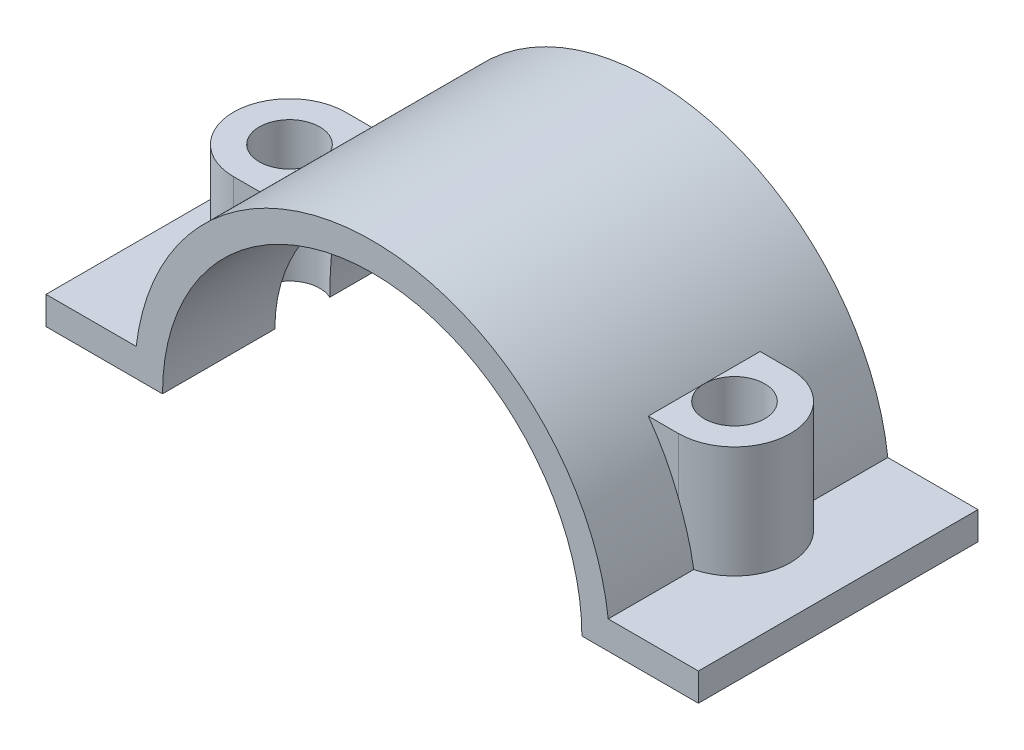
ISO-10303-21;
HEADER;
FILE_DESCRIPTION(('STEP AP214'),'2;1');
FILE_NAME('part.step','',(''),(''),'','','');
FILE_SCHEMA(('AUTOMOTIVE_DESIGN { 1 0 10303 214 1 1 1 1 }'));
ENDSEC;
DATA;
#1=APPLICATION_CONTEXT('core data for automotive mechanical design processes');
#2=APPLICATION_PROTOCOL_DEFINITION('international standard','automotive_design',2000,#1);
#3=PRODUCT_CONTEXT('',#1,'mechanical');
#4=PRODUCT('Part','Part','',(#3));
#5=PRODUCT_RELATED_PRODUCT_CATEGORY('part','',(#4));
#6=PRODUCT_DEFINITION_FORMATION('','',#4);
#7=PRODUCT_DEFINITION_CONTEXT('part definition',#1,'design');
#8=PRODUCT_DEFINITION('design','',#6,#7);
#9=PRODUCT_DEFINITION_SHAPE('','',#8);
#10=(LENGTH_UNIT() NAMED_UNIT(*) SI_UNIT(.MILLI.,.METRE.));
#11=(NAMED_UNIT(*) PLANE_ANGLE_UNIT() SI_UNIT($,.RADIAN.));
#12=(NAMED_UNIT(*) SI_UNIT($,.STERADIAN.) SOLID_ANGLE_UNIT());
#13=UNCERTAINTY_MEASURE_WITH_UNIT(LENGTH_MEASURE(1.E-05),#10,'distance_accuracy_value','');
#14=(GEOMETRIC_REPRESENTATION_CONTEXT(3) GLOBAL_UNCERTAINTY_ASSIGNED_CONTEXT((#13)) GLOBAL_UNIT_ASSIGNED_CONTEXT((#10,
#11,#12)) REPRESENTATION_CONTEXT('',''));
#15=CARTESIAN_POINT('',(0.,0.,0.));
#16=DIRECTION('',(0.,0.,1.));
#17=DIRECTION('',(1.,0.,0.));
#18=AXIS2_PLACEMENT_3D('',#15,#16,#17);
#19=CARTESIAN_POINT('',(0.,0.,15.));
#20=DIRECTION('',(0.,0.,-1.));
#21=DIRECTION('',(-1.,0.,0.));
#22=AXIS2_PLACEMENT_3D('',#19,#20,#21);
#23=CYLINDRICAL_SURFACE('',#22,22.5);
#24=CARTESIAN_POINT('',(22.5,0.,2.94585244223194));
#25=CARTESIAN_POINT('',(22.5000019786438,0.22004829541047,2.94582502954506));
#26=CARTESIAN_POINT('',(22.496771976051,0.440098921720214,2.94434706345401));
#27=CARTESIAN_POINT('',(22.4838614086812,0.879984524522893,2.93829426645985));
#28=CARTESIAN_POINT('',(22.4741803541386,1.09981948337314,2.93371920042374));
#29=CARTESIAN_POINT('',(22.4483384018866,1.53974661329548,2.9212558035351));
#30=CARTESIAN_POINT('',(22.4321561682467,1.75983722837948,2.91335655911638));
#31=CARTESIAN_POINT('',(22.3933430806954,2.19928099204081,2.89384152261642));
#32=CARTESIAN_POINT('',(22.3707123665342,2.41863415649579,2.88222581107707));
#33=CARTESIAN_POINT('',(22.3177048362647,2.86771611810231,2.85399237610849));
#34=CARTESIAN_POINT('',(22.2869860658927,3.09739050786812,2.83714571038818));
#35=CARTESIAN_POINT('',(22.2185524494044,3.55520608774392,2.79779869713993));
#36=CARTESIAN_POINT('',(22.1808378924326,3.7833473408167,2.77529858326245));
#37=CARTESIAN_POINT('',(22.0986125509884,4.23726788281951,2.72346907843097));
#38=CARTESIAN_POINT('',(22.0541122674826,4.46305025497699,2.69415020336566));
#39=CARTESIAN_POINT('',(21.9584991151918,4.91191850706664,2.62707932526148));
#40=CARTESIAN_POINT('',(21.9073877568558,5.13500499024424,2.58932924709352));
#41=CARTESIAN_POINT('',(21.7998289729832,5.57383345127611,2.5040199291954));
#42=CARTESIAN_POINT('',(21.7434877454334,5.78963578722072,2.45663947366215));
#43=CARTESIAN_POINT('',(21.6252370772924,6.21676696922478,2.34895831258528));
#44=CARTESIAN_POINT('',(21.5633227921508,6.42809172200731,2.28864630171863));
#45=CARTESIAN_POINT('',(21.4674570711155,6.73868537467435,2.18613284156853));
#46=CARTESIAN_POINT('',(21.4352043380002,6.84056064775407,2.15020407303379));
#47=CARTESIAN_POINT('',(21.3697921265074,7.04224446072956,2.07369778279248));
#48=CARTESIAN_POINT('',(21.3366328390056,7.14205342802811,2.03312123402708));
#49=CARTESIAN_POINT('',(21.269709677642,7.33895404304251,1.94670028355243));
#50=CARTESIAN_POINT('',(21.235946896523,7.4360499189808,1.9008647213245));
#51=CARTESIAN_POINT('',(21.1681263285494,7.62697016127641,1.80306235107284));
#52=CARTESIAN_POINT('',(21.1340686944474,7.72079610826381,1.75109856012069));
#53=CARTESIAN_POINT('',(21.0757392979934,7.87833413650594,1.6557134191039));
#54=CARTESIAN_POINT('',(21.0514180944343,7.94307261635632,1.6140193807915));
#55=CARTESIAN_POINT('',(21.0031314212219,8.06988666780331,1.52652083152144));
#56=CARTESIAN_POINT('',(20.9791660130466,8.13196178261844,1.4807156196074));
#57=CARTESIAN_POINT('',(20.9319743804309,8.25267464722253,1.38462135264109));
#58=CARTESIAN_POINT('',(20.9087469501857,8.31131815169628,1.33434018283709));
#59=CARTESIAN_POINT('',(20.8634535146701,8.42437031116534,1.22878261003766));
#60=CARTESIAN_POINT('',(20.8413868488207,8.47878138342286,1.17350909788105));
#61=CARTESIAN_POINT('',(20.7942977518278,8.59370862505898,1.04465413885524));
#62=CARTESIAN_POINT('',(20.7696995262872,8.65291739636186,0.969725956397005));
#63=CARTESIAN_POINT('',(20.724562124205,8.76047544105549,0.811262691529925));
#64=CARTESIAN_POINT('',(20.7040185858127,8.80883639177732,0.727737006787183));
#65=CARTESIAN_POINT('',(20.6720940224812,8.88346046495895,0.568827848417073));
#66=CARTESIAN_POINT('',(20.659720642496,8.91215758983417,0.49480248089083));
#67=CARTESIAN_POINT('',(20.6399523791574,8.9578454412186,0.342582102008905));
#68=CARTESIAN_POINT('',(20.6325522185234,8.97484857713334,0.264391605862199));
#69=CARTESIAN_POINT('',(20.6234858809565,8.9956639490221,0.105448870119819));
#70=CARTESIAN_POINT('',(20.6218523630032,8.99940105441533,0.0246846452861547));
#71=CARTESIAN_POINT('',(20.6246121853143,8.99307410226032,-0.136200070882619));
#72=CARTESIAN_POINT('',(20.6290065656823,8.98300766293402,-0.216320448723444));
#73=CARTESIAN_POINT('',(20.6427016005542,8.95148731521266,-0.366738071456857));
#74=CARTESIAN_POINT('',(20.6515620232383,8.93105425902292,-0.437296979580218));
#75=CARTESIAN_POINT('',(20.6731590254648,8.88094816200981,-0.574383004774032));
#76=CARTESIAN_POINT('',(20.685897128057,8.85127149043293,-0.640908525302781));
#77=CARTESIAN_POINT('',(20.7223901646504,8.76559916892526,-0.805115794685439));
#78=CARTESIAN_POINT('',(20.748325820282,8.70415880459091,-0.899462553885803));
#79=CARTESIAN_POINT('',(20.8048456642171,8.56818729043554,-1.07663718150113));
#80=CARTESIAN_POINT('',(20.8354425025953,8.49362042800028,-1.15943249180065));
#81=CARTESIAN_POINT('',(20.8944862378732,8.34719909046049,-1.30287736736085));
#82=CARTESIAN_POINT('',(20.9225719469765,8.27660222314841,-1.36498768691245));
#83=CARTESIAN_POINT('',(20.9798265469158,8.13037801292532,-1.48248007189674));
#84=CARTESIAN_POINT('',(21.0089962352372,8.05474693262348,-1.53785705032177));
#85=CARTESIAN_POINT('',(21.0678384332305,7.89956233855251,-1.64273156681119));
#86=CARTESIAN_POINT('',(21.0975116081605,7.82000331843033,-1.692220499397));
#87=CARTESIAN_POINT('',(21.1569040649136,7.65786333469737,-1.78598396631352));
#88=CARTESIAN_POINT('',(21.186623360279,7.57528119504474,-1.83025644248918));
#89=CARTESIAN_POINT('',(21.2468907937366,7.40460156350316,-1.91577162963314));
#90=CARTESIAN_POINT('',(21.2774284476149,7.31641326889604,-1.95683949793599));
#91=CARTESIAN_POINT('',(21.3379600725344,7.13795151419706,-2.03463582902053));
#92=CARTESIAN_POINT('',(21.3679539215587,7.04767759622676,-2.07136332788278));
#93=CARTESIAN_POINT('',(21.4568691289714,6.77417725311325,-2.17587087204433));
#94=CARTESIAN_POINT('',(21.5146824087259,6.58838996043499,-2.23791899170511));
#95=CARTESIAN_POINT('',(21.6266438306371,6.21106207191854,-2.35027359719613));
#96=CARTESIAN_POINT('',(21.6807689320824,6.0194944915116,-2.40051035978475));
#97=CARTESIAN_POINT('',(21.784399082268,5.63293742157482,-2.4911857249269));
#98=CARTESIAN_POINT('',(21.8339059629967,5.4379493257008,-2.53162822298754));
#99=CARTESIAN_POINT('',(21.9323942002945,5.02681697113072,-2.60801546735056));
#100=CARTESIAN_POINT('',(21.9808856952234,4.81041171934231,-2.64317636090871));
#101=CARTESIAN_POINT('',(22.0716403467898,4.37517205768449,-2.70583150031386));
#102=CARTESIAN_POINT('',(22.1139022221525,4.15633715802279,-2.73332417003607));
#103=CARTESIAN_POINT('',(22.1920515702151,3.71655675986395,-2.78206046126463));
#104=CARTESIAN_POINT('',(22.2279307387261,3.49560890026338,-2.80329596514111));
#105=CARTESIAN_POINT('',(22.2931292927456,3.0523078428312,-2.84054457406559));
#106=CARTESIAN_POINT('',(22.3224484256862,2.82995459122938,-2.85655747804917));
#107=CARTESIAN_POINT('',(22.3736815914145,2.39077381449471,-2.88376441510917));
#108=CARTESIAN_POINT('',(22.3957883855284,2.17397655059012,-2.89508655076947));
#109=CARTESIAN_POINT('',(22.4337037517035,1.73967068926701,-2.91411753874415));
#110=CARTESIAN_POINT('',(22.4495121737262,1.52216207502729,-2.9218263049824));
#111=CARTESIAN_POINT('',(22.474764515414,1.08731380698403,-2.933995966094));
#112=CARTESIAN_POINT('',(22.4842265756365,0.869975460660682,-2.93846612123538));
#113=CARTESIAN_POINT('',(22.4968450260418,0.435090653214143,-2.94438115300763));
#114=CARTESIAN_POINT('',(22.5000018913383,0.217544209007704,-2.94582625758473));
#115=CARTESIAN_POINT('',(22.5,0.,-2.94585244223194));
#116=B_SPLINE_CURVE_WITH_KNOTS('',3,(#24,#25,#26,#27,#28,#29,#30,#31,#32,#33,#34,#35,#36,#37,
#38,#39,#40,#41,#42,#43,#44,#45,#46,#47,#48,#49,#50,#51,#52,#53,#54,#55,#56,#57,#58,#59,#60,#61,
#62,#63,#64,#65,#66,#67,#68,#69,#70,#71,#72,#73,#74,#75,#76,#77,#78,#79,#80,#81,#82,#83,#84,#85,
#86,#87,#88,#89,#90,#91,#92,#93,#94,#95,#96,#97,#98,#99,#100,#101,#102,#103,#104,#105,#106,#107,
#108,#109,#110,#111,#112,#113,#114,#115),.UNSPECIFIED.,.F.,.F.,(4,2,2,2,2,2,2,2,2,2,2,2,2,2,2,2,
2,2,2,2,2,2,2,2,2,2,2,2,2,2,2,2,2,2,2,2,2,2,2,2,2,2,2,2,2,4),(0.,0.660119952515278,
1.32029002720668,1.9826446182481,2.64498485596214,3.34180983768661,4.03860602517878,
4.7343346574878,5.42990461477266,6.11357975970354,6.79785505788478,7.1359734889572,
7.47402126905596,7.81150895153736,8.14883116909893,8.39096500916579,8.63314021183896,
8.87489691522273,9.11651451494224,9.41151793348284,9.70620224982488,9.94629561421661,
10.1861338020197,10.4273281367469,10.6685640943817,10.8896603050445,11.1108434687297,
11.4554802638301,11.8010696098652,12.0950547732489,12.3892606789163,12.6838914226939,
12.978638026629,13.2843896871879,13.5902091226957,14.2022584248279,14.817834743687,
15.4331658236359,16.1065266965556,16.7800258700792,17.4543949878935,18.1287900651223,
18.7833111789586,19.4378478837221,20.0905055832023,20.7431141012859),.UNSPECIFIED.);
#117=CARTESIAN_POINT('',(22.5,0.,2.94585244223194));
#118=VERTEX_POINT('',#117);
#119=CARTESIAN_POINT('',(22.5,0.,-2.94585244223194));
#120=VERTEX_POINT('',#119);
#121=EDGE_CURVE('E53',#118,#120,#116,.T.);
#122=ORIENTED_EDGE('',*,*,#121,.F.);
#123=DIRECTION('',(0.,0.,-1.));
#124=VECTOR('',#123,1.);
#125=CARTESIAN_POINT('',(22.5,0.,15.));
#126=LINE('',#125,#124);
#127=CARTESIAN_POINT('',(22.5,0.,15.));
#128=VERTEX_POINT('',#127);
#129=EDGE_CURVE('E172',#128,#118,#126,.T.);
#130=ORIENTED_EDGE('',*,*,#129,.F.);
#131=CARTESIAN_POINT('',(0.,0.,15.));
#132=DIRECTION('',(0.,0.,-1.));
#133=DIRECTION('',(1.,0.,0.));
#134=AXIS2_PLACEMENT_3D('',#131,#132,#133);
#135=CIRCLE('',#134,22.5);
#136=CARTESIAN_POINT('',(-22.5,0.,15.));
#137=VERTEX_POINT('',#136);
#138=EDGE_CURVE('E449',#137,#128,#135,.T.);
#139=ORIENTED_EDGE('',*,*,#138,.F.);
#140=DIRECTION('',(0.,0.,-1.));
#141=VECTOR('',#140,1.);
#142=CARTESIAN_POINT('',(-22.5,0.,15.));
#143=LINE('',#142,#141);
#144=CARTESIAN_POINT('',(-22.5,0.,2.94585244223194));
#145=VERTEX_POINT('',#144);
#146=EDGE_CURVE('E183',#137,#145,#143,.T.);
#147=ORIENTED_EDGE('',*,*,#146,.T.);
#148=CARTESIAN_POINT('',(-22.5,0.,2.94585244223194));
#149=CARTESIAN_POINT('',(-22.5000019786438,0.22004829541047,2.94582502954506));
#150=CARTESIAN_POINT('',(-22.496771976051,0.440098921720214,2.94434706345401));
#151=CARTESIAN_POINT('',(-22.4838614086812,0.879984524522893,2.93829426645985));
#152=CARTESIAN_POINT('',(-22.4741803541386,1.09981948337314,2.93371920042374));
#153=CARTESIAN_POINT('',(-22.4483384018866,1.53974661329548,2.9212558035351));
#154=CARTESIAN_POINT('',(-22.4321561682467,1.75983722837948,2.91335655911638));
#155=CARTESIAN_POINT('',(-22.3933430806954,2.19928099204081,2.89384152261642));
#156=CARTESIAN_POINT('',(-22.3707123665342,2.41863415649579,2.88222581107707));
#157=CARTESIAN_POINT('',(-22.3177048362647,2.86771611810231,2.85399237610849));
#158=CARTESIAN_POINT('',(-22.2869860658927,3.09739050786812,2.83714571038818));
#159=CARTESIAN_POINT('',(-22.2185524494044,3.55520608774392,2.79779869713993));
#160=CARTESIAN_POINT('',(-22.1808378924326,3.7833473408167,2.77529858326245));
#161=CARTESIAN_POINT('',(-22.0986125509884,4.23726788281951,2.72346907843097));
#162=CARTESIAN_POINT('',(-22.0541122674826,4.46305025497699,2.69415020336566));
#163=CARTESIAN_POINT('',(-21.9584991151918,4.91191850706664,2.62707932526148));
#164=CARTESIAN_POINT('',(-21.9073877568558,5.13500499024424,2.58932924709352));
#165=CARTESIAN_POINT('',(-21.7998289729832,5.57383345127611,2.5040199291954));
#166=CARTESIAN_POINT('',(-21.7434877454334,5.78963578722072,2.45663947366215));
#167=CARTESIAN_POINT('',(-21.6252370772924,6.21676696922478,2.34895831258528));
#168=CARTESIAN_POINT('',(-21.5633227921508,6.42809172200731,2.28864630171863));
#169=CARTESIAN_POINT('',(-21.4674570711155,6.73868537467435,2.18613284156853));
#170=CARTESIAN_POINT('',(-21.4352043380002,6.84056064775407,2.15020407303379));
#171=CARTESIAN_POINT('',(-21.3697921265074,7.04224446072956,2.07369778279248));
#172=CARTESIAN_POINT('',(-21.3366328390056,7.14205342802811,2.03312123402708));
#173=CARTESIAN_POINT('',(-21.269709677642,7.33895404304251,1.94670028355243));
#174=CARTESIAN_POINT('',(-21.235946896523,7.4360499189808,1.9008647213245));
#175=CARTESIAN_POINT('',(-21.1681263285494,7.62697016127641,1.80306235107284));
#176=CARTESIAN_POINT('',(-21.1340686944474,7.72079610826381,1.75109856012069));
#177=CARTESIAN_POINT('',(-21.0757392979934,7.87833413650594,1.6557134191039));
#178=CARTESIAN_POINT('',(-21.0514180944343,7.94307261635632,1.6140193807915));
#179=CARTESIAN_POINT('',(-21.0031314212219,8.06988666780331,1.52652083152144));
#180=CARTESIAN_POINT('',(-20.9791660130466,8.13196178261844,1.4807156196074));
#181=CARTESIAN_POINT('',(-20.9319743804309,8.25267464722253,1.38462135264109));
#182=CARTESIAN_POINT('',(-20.9087469501857,8.31131815169628,1.33434018283709));
#183=CARTESIAN_POINT('',(-20.8634535146701,8.42437031116534,1.22878261003766));
#184=CARTESIAN_POINT('',(-20.8413868488207,8.47878138342286,1.17350909788105));
#185=CARTESIAN_POINT('',(-20.7942977518278,8.59370862505898,1.04465413885524));
#186=CARTESIAN_POINT('',(-20.7696995262872,8.65291739636186,0.969725956397005));
#187=CARTESIAN_POINT('',(-20.724562124205,8.76047544105549,0.811262691529925));
#188=CARTESIAN_POINT('',(-20.7040185858127,8.80883639177732,0.727737006787183));
#189=CARTESIAN_POINT('',(-20.6720940224812,8.88346046495895,0.568827848417073));
#190=CARTESIAN_POINT('',(-20.659720642496,8.91215758983417,0.49480248089083));
#191=CARTESIAN_POINT('',(-20.6399523791574,8.9578454412186,0.342582102008905));
#192=CARTESIAN_POINT('',(-20.6325522185234,8.97484857713334,0.264391605862199));
#193=CARTESIAN_POINT('',(-20.6234858809565,8.9956639490221,0.105448870119819));
#194=CARTESIAN_POINT('',(-20.6218523630032,8.99940105441533,0.0246846452861547));
#195=CARTESIAN_POINT('',(-20.6246121853143,8.99307410226032,-0.136200070882619));
#196=CARTESIAN_POINT('',(-20.6290065656823,8.98300766293402,-0.216320448723444));
#197=CARTESIAN_POINT('',(-20.6427016005542,8.95148731521266,-0.366738071456857));
#198=CARTESIAN_POINT('',(-20.6515620232383,8.93105425902292,-0.437296979580218));
#199=CARTESIAN_POINT('',(-20.6731590254648,8.88094816200981,-0.574383004774032));
#200=CARTESIAN_POINT('',(-20.685897128057,8.85127149043293,-0.640908525302781));
#201=CARTESIAN_POINT('',(-20.7223901646504,8.76559916892526,-0.805115794685439));
#202=CARTESIAN_POINT('',(-20.748325820282,8.70415880459091,-0.899462553885803));
#203=CARTESIAN_POINT('',(-20.8048456642171,8.56818729043554,-1.07663718150113));
#204=CARTESIAN_POINT('',(-20.8354425025953,8.49362042800028,-1.15943249180065));
#205=CARTESIAN_POINT('',(-20.8944862378732,8.34719909046049,-1.30287736736085));
#206=CARTESIAN_POINT('',(-20.9225719469765,8.27660222314841,-1.36498768691245));
#207=CARTESIAN_POINT('',(-20.9798265469158,8.13037801292532,-1.48248007189674));
#208=CARTESIAN_POINT('',(-21.0089962352372,8.05474693262348,-1.53785705032177));
#209=CARTESIAN_POINT('',(-21.0678384332305,7.89956233855251,-1.64273156681119));
#210=CARTESIAN_POINT('',(-21.0975116081605,7.82000331843033,-1.692220499397));
#211=CARTESIAN_POINT('',(-21.1569040649136,7.65786333469737,-1.78598396631352));
#212=CARTESIAN_POINT('',(-21.186623360279,7.57528119504474,-1.83025644248918));
#213=CARTESIAN_POINT('',(-21.2468907937366,7.40460156350316,-1.91577162963314));
#214=CARTESIAN_POINT('',(-21.2774284476149,7.31641326889604,-1.95683949793599));
#215=CARTESIAN_POINT('',(-21.3379600725344,7.13795151419706,-2.03463582902053));
#216=CARTESIAN_POINT('',(-21.3679539215587,7.04767759622676,-2.07136332788278));
#217=CARTESIAN_POINT('',(-21.4568691289714,6.77417725311325,-2.17587087204433));
#218=CARTESIAN_POINT('',(-21.5146824087259,6.58838996043499,-2.23791899170511));
#219=CARTESIAN_POINT('',(-21.6266438306371,6.21106207191854,-2.35027359719613));
#220=CARTESIAN_POINT('',(-21.6807689320824,6.0194944915116,-2.40051035978475));
#221=CARTESIAN_POINT('',(-21.784399082268,5.63293742157482,-2.4911857249269));
#222=CARTESIAN_POINT('',(-21.8339059629967,5.4379493257008,-2.53162822298754));
#223=CARTESIAN_POINT('',(-21.9323942002945,5.02681697113072,-2.60801546735056));
#224=CARTESIAN_POINT('',(-21.9808856952234,4.81041171934231,-2.64317636090871));
#225=CARTESIAN_POINT('',(-22.0716403467898,4.37517205768449,-2.70583150031386));
#226=CARTESIAN_POINT('',(-22.1139022221525,4.15633715802279,-2.73332417003607));
#227=CARTESIAN_POINT('',(-22.1920515702151,3.71655675986395,-2.78206046126463));
#228=CARTESIAN_POINT('',(-22.2279307387261,3.49560890026338,-2.80329596514111));
#229=CARTESIAN_POINT('',(-22.2931292927456,3.0523078428312,-2.84054457406559));
#230=CARTESIAN_POINT('',(-22.3224484256862,2.82995459122938,-2.85655747804917));
#231=CARTESIAN_POINT('',(-22.3736815914145,2.39077381449471,-2.88376441510917));
#232=CARTESIAN_POINT('',(-22.3957883855284,2.17397655059012,-2.89508655076947));
#233=CARTESIAN_POINT('',(-22.4337037517035,1.73967068926701,-2.91411753874415));
#234=CARTESIAN_POINT('',(-22.4495121737262,1.52216207502729,-2.9218263049824));
#235=CARTESIAN_POINT('',(-22.474764515414,1.08731380698403,-2.933995966094));
#236=CARTESIAN_POINT('',(-22.4842265756365,0.869975460660682,-2.93846612123538));
#237=CARTESIAN_POINT('',(-22.4968450260418,0.435090653214143,-2.94438115300763));
#238=CARTESIAN_POINT('',(-22.5000018913383,0.217544209007704,-2.94582625758473));
#239=CARTESIAN_POINT('',(-22.5,0.,-2.94585244223194));
#240=B_SPLINE_CURVE_WITH_KNOTS('',3,(#148,#149,#150,#151,#152,#153,#154,#155,#156,#157,#158,
#159,#160,#161,#162,#163,#164,#165,#166,#167,#168,#169,#170,#171,#172,#173,#174,#175,#176,#177,
#178,#179,#180,#181,#182,#183,#184,#185,#186,#187,#188,#189,#190,#191,#192,#193,#194,#195,#196,
#197,#198,#199,#200,#201,#202,#203,#204,#205,#206,#207,#208,#209,#210,#211,#212,#213,#214,#215,
#216,#217,#218,#219,#220,#221,#222,#223,#224,#225,#226,#227,#228,#229,#230,#231,#232,#233,#234,
#235,#236,#237,#238,#239),.UNSPECIFIED.,.F.,.F.,(4,2,2,2,2,2,2,2,2,2,2,2,2,2,2,2,2,2,2,2,2,2,2,
2,2,2,2,2,2,2,2,2,2,2,2,2,2,2,2,2,2,2,2,2,2,4),(0.,0.660119952515278,1.32029002720668,
1.9826446182481,2.64498485596214,3.34180983768661,4.03860602517878,4.7343346574878,
5.42990461477266,6.11357975970354,6.79785505788478,7.1359734889572,7.47402126905596,
7.81150895153736,8.14883116909893,8.39096500916579,8.63314021183896,8.87489691522273,
9.11651451494224,9.41151793348284,9.70620224982488,9.94629561421661,10.1861338020197,
10.4273281367469,10.6685640943817,10.8896603050445,11.1108434687297,11.4554802638301,
11.8010696098652,12.0950547732489,12.3892606789163,12.6838914226939,12.978638026629,
13.2843896871879,13.5902091226957,14.2022584248279,14.817834743687,15.4331658236359,
16.1065266965556,16.7800258700792,17.4543949878935,18.1287900651223,18.7833111789586,
19.4378478837221,20.0905055832023,20.7431141012859),.UNSPECIFIED.);
#241=CARTESIAN_POINT('',(-22.5,0.,-2.94585244223194));
#242=VERTEX_POINT('',#241);
#243=EDGE_CURVE('E318',#145,#242,#240,.T.);
#244=ORIENTED_EDGE('',*,*,#243,.T.);
#245=CARTESIAN_POINT('',(-22.5,0.,-15.));
#246=VERTEX_POINT('',#245);
#247=EDGE_CURVE('E181',#242,#246,#143,.T.);
#248=ORIENTED_EDGE('',*,*,#247,.T.);
#249=CARTESIAN_POINT('',(0.,0.,-15.));
#250=DIRECTION('',(0.,0.,-1.));
#251=DIRECTION('',(1.,0.,0.));
#252=AXIS2_PLACEMENT_3D('',#249,#250,#251);
#253=CIRCLE('',#252,22.5);
#254=CARTESIAN_POINT('',(22.5,0.,-15.));
#255=VERTEX_POINT('',#254);
#256=EDGE_CURVE('E231',#246,#255,#253,.T.);
#257=ORIENTED_EDGE('',*,*,#256,.T.);
#258=EDGE_CURVE('E175',#120,#255,#126,.T.);
#259=ORIENTED_EDGE('',*,*,#258,.F.);
#260=EDGE_LOOP('',(#122,#130,#139,#147,#244,#248,#257,#259));
#261=FACE_BOUND('',#260,.T.);
#262=ADVANCED_FACE('F39',(#261),#23,.F.);
#263=CARTESIAN_POINT('',(0.,0.,15.));
#264=DIRECTION('',(0.,0.,-1.));
#265=DIRECTION('',(-1.,0.,0.));
#266=AXIS2_PLACEMENT_3D('',#263,#264,#265);
#267=CYLINDRICAL_SURFACE('',#266,25.5);
#268=CARTESIAN_POINT('',(25.3229145242012,3.,5.82211596323335));
#269=CARTESIAN_POINT('',(25.2927017094177,3.25503375803972,5.82962677957864));
#270=CARTESIAN_POINT('',(25.2586370536783,3.50958713600711,5.83787595111621));
#271=CARTESIAN_POINT('',(25.1828418332552,4.01751108971401,5.85535886071538));
#272=CARTESIAN_POINT('',(25.141111424897,4.27088168946554,5.86459257869779));
#273=CARTESIAN_POINT('',(25.0501886066943,4.77529993587992,5.88351794616319));
#274=CARTESIAN_POINT('',(25.0010241818331,5.02635269738003,5.89320778814009));
#275=CARTESIAN_POINT('',(24.8951626275772,5.52687154360048,5.91249338419174));
#276=CARTESIAN_POINT('',(24.8384654188644,5.77633761158439,5.92208913727462));
#277=CARTESIAN_POINT('',(24.7175813447213,6.27348517405599,5.94053911173737));
#278=CARTESIAN_POINT('',(24.653394244493,6.52116661233935,5.94939330985553));
#279=CARTESIAN_POINT('',(24.5175833056269,7.01452571445237,5.96564073281929));
#280=CARTESIAN_POINT('',(24.445959628654,7.26020342171625,5.97303398941437));
#281=CARTESIAN_POINT('',(24.2950529464625,7.75024940232854,5.98560182658075));
#282=CARTESIAN_POINT('',(24.2157426689699,7.99460950544111,5.99076812448328));
#283=CARTESIAN_POINT('',(24.0497544791468,8.48088092881685,5.99796038029116));
#284=CARTESIAN_POINT('',(23.9630759803952,8.72279205245304,5.99998608799627));
#285=CARTESIAN_POINT('',(23.8727539432091,8.9633486581185,6.));
#286=B_SPLINE_CURVE_WITH_KNOTS('',3,(#268,#269,#270,#271,#272,#273,#274,#275,#276,#277,#278,
#279,#280,#281,#282,#283,#284,#285),.UNSPECIFIED.,.F.,.F.,(4,2,2,2,2,2,2,2,4),(0.,
0.770747269147219,1.54147882241765,2.30937808282047,3.07728542962722,3.84521685577623,
4.61313159124751,5.3838782724095,6.15468635320599),.UNSPECIFIED.);
#287=CARTESIAN_POINT('',(25.3229145242012,3.,5.82211596323335));
#288=VERTEX_POINT('',#287);
#289=CARTESIAN_POINT('',(23.8727539432091,8.96334865811849,6.));
#290=VERTEX_POINT('',#289);
#291=EDGE_CURVE('E61',#288,#290,#286,.T.);
#292=ORIENTED_EDGE('',*,*,#291,.T.);
#293=CARTESIAN_POINT('',(0.,0.,6.));
#294=DIRECTION('',(0.,0.,-1.));
#295=DIRECTION('',(-1.,0.,0.));
#296=AXIS2_PLACEMENT_3D('',#293,#294,#295);
#297=CIRCLE('',#296,25.5);
#298=CARTESIAN_POINT('',(20.6215906273013,15.,6.));
#299=VERTEX_POINT('',#298);
#300=EDGE_CURVE('E263',#290,#299,#297,.F.);
#301=ORIENTED_EDGE('',*,*,#300,.T.);
#302=DIRECTION('',(0.,0.,-1.));
#303=VECTOR('',#302,1.);
#304=CARTESIAN_POINT('',(20.6215906273013,15.,15.));
#305=LINE('',#304,#303);
#306=CARTESIAN_POINT('',(20.6215906273013,15.,-6.));
#307=VERTEX_POINT('',#306);
#308=EDGE_CURVE('E331',#307,#299,#305,.F.);
#309=ORIENTED_EDGE('',*,*,#308,.F.);
#310=CARTESIAN_POINT('',(0.,0.,-6.));
#311=DIRECTION('',(0.,0.,1.));
#312=DIRECTION('',(1.,0.,0.));
#313=AXIS2_PLACEMENT_3D('',#310,#311,#312);
#314=CIRCLE('',#313,25.5);
#315=CARTESIAN_POINT('',(23.8727539432091,8.96334865811849,-6.));
#316=VERTEX_POINT('',#315);
#317=EDGE_CURVE('E176',#307,#316,#314,.F.);
#318=ORIENTED_EDGE('',*,*,#317,.T.);
#319=CARTESIAN_POINT('',(23.8727539432091,8.96334865811849,-6.));
#320=CARTESIAN_POINT('',(23.9630759803952,8.72279205245304,-5.99998608799627));
#321=CARTESIAN_POINT('',(24.0497544791468,8.48088092881685,-5.99796038029116));
#322=CARTESIAN_POINT('',(24.2157426689699,7.99460950544111,-5.99076812448328));
#323=CARTESIAN_POINT('',(24.2950529464625,7.75024940232854,-5.98560182658075));
#324=CARTESIAN_POINT('',(24.445959628654,7.26020342171625,-5.97303398941437));
#325=CARTESIAN_POINT('',(24.5175833056269,7.01452571445237,-5.96564073281929));
#326=CARTESIAN_POINT('',(24.653394244493,6.52116661233935,-5.94939330985553));
#327=CARTESIAN_POINT('',(24.7175813447213,6.27348517405599,-5.94053911173737));
#328=CARTESIAN_POINT('',(24.8384654188644,5.77633761158439,-5.92208913727462));
#329=CARTESIAN_POINT('',(24.8951626275772,5.52687154360048,-5.91249338419174));
#330=CARTESIAN_POINT('',(25.0010241818331,5.02635269738003,-5.89320778814009));
#331=CARTESIAN_POINT('',(25.0501886066943,4.77529993587992,-5.88351794616319));
#332=CARTESIAN_POINT('',(25.141111424897,4.27088168946555,-5.86459257869779));
#333=CARTESIAN_POINT('',(25.1828418332552,4.01751108971401,-5.85535886071537));
#334=CARTESIAN_POINT('',(25.2586370536783,3.50958713600711,-5.83787595111622));
#335=CARTESIAN_POINT('',(25.2927017094177,3.25503375803972,-5.82962677957867));
#336=CARTESIAN_POINT('',(25.3229145242012,3.,-5.82211596323344));
#337=B_SPLINE_CURVE_WITH_KNOTS('',3,(#319,#320,#321,#322,#323,#324,#325,#326,#327,#328,#329,
#330,#331,#332,#333,#334,#335,#336),.UNSPECIFIED.,.F.,.F.,(4,2,2,2,2,2,2,2,4),(0.,
0.770808080796482,1.54155476195848,2.30946949742976,3.07740092357877,3.84530827038552,
4.61320753078833,5.38393908405876,6.15468635320599),.UNSPECIFIED.);
#338=CARTESIAN_POINT('',(25.3229145242012,3.,-5.82211596323335));
#339=VERTEX_POINT('',#338);
#340=EDGE_CURVE('E259',#316,#339,#337,.T.);
#341=ORIENTED_EDGE('',*,*,#340,.T.);
#342=DIRECTION('',(0.,0.,-1.));
#343=VECTOR('',#342,1.);
#344=CARTESIAN_POINT('',(25.3229145242012,3.,15.));
#345=LINE('',#344,#343);
#346=CARTESIAN_POINT('',(25.3229145242012,3.,-15.));
#347=VERTEX_POINT('',#346);
#348=EDGE_CURVE('E216',#339,#347,#345,.T.);
#349=ORIENTED_EDGE('',*,*,#348,.T.);
#350=CARTESIAN_POINT('',(0.,0.,-15.));
#351=DIRECTION('',(0.,0.,1.));
#352=DIRECTION('',(1.,0.,0.));
#353=AXIS2_PLACEMENT_3D('',#350,#351,#352);
#354=CIRCLE('',#353,25.5);
#355=CARTESIAN_POINT('',(-25.3229145242012,3.,-15.));
#356=VERTEX_POINT('',#355);
#357=EDGE_CURVE('E211',#347,#356,#354,.T.);
#358=ORIENTED_EDGE('',*,*,#357,.T.);
#359=DIRECTION('',(0.,0.,-1.));
#360=VECTOR('',#359,1.);
#361=CARTESIAN_POINT('',(-25.3229145242012,3.,15.));
#362=LINE('',#361,#360);
#363=CARTESIAN_POINT('',(-25.3229145242012,3.,-5.82211596323335));
#364=VERTEX_POINT('',#363);
#365=EDGE_CURVE('E47',#364,#356,#362,.T.);
#366=ORIENTED_EDGE('',*,*,#365,.F.);
#367=CARTESIAN_POINT('',(-23.8727539432091,8.96334865811849,-6.));
#368=CARTESIAN_POINT('',(-23.9630759803952,8.72279205245304,-5.99998608799627));
#369=CARTESIAN_POINT('',(-24.0497544791468,8.48088092881685,-5.99796038029116));
#370=CARTESIAN_POINT('',(-24.2157426689699,7.99460950544111,-5.99076812448328));
#371=CARTESIAN_POINT('',(-24.2950529464625,7.75024940232854,-5.98560182658075));
#372=CARTESIAN_POINT('',(-24.445959628654,7.26020342171625,-5.97303398941437));
#373=CARTESIAN_POINT('',(-24.5175833056269,7.01452571445237,-5.96564073281929));
#374=CARTESIAN_POINT('',(-24.653394244493,6.52116661233935,-5.94939330985553));
#375=CARTESIAN_POINT('',(-24.7175813447213,6.273485174056,-5.94053911173737));
#376=CARTESIAN_POINT('',(-24.8384654188644,5.7763376115844,-5.92208913727462));
#377=CARTESIAN_POINT('',(-24.8951626275772,5.52687154360048,-5.91249338419174));
#378=CARTESIAN_POINT('',(-25.0010241818331,5.02635269738003,-5.89320778814009));
#379=CARTESIAN_POINT('',(-25.0501886066943,4.77529993587993,-5.88351794616319));
#380=CARTESIAN_POINT('',(-25.141111424897,4.27088168946555,-5.86459257869779));
#381=CARTESIAN_POINT('',(-25.1828418332552,4.01751108971401,-5.85535886071537));
#382=CARTESIAN_POINT('',(-25.2586370536783,3.50958713600711,-5.83787595111622));
#383=CARTESIAN_POINT('',(-25.2927017094177,3.25503375803972,-5.82962677957867));
#384=CARTESIAN_POINT('',(-25.3229145242012,3.,-5.82211596323344));
#385=B_SPLINE_CURVE_WITH_KNOTS('',3,(#367,#368,#369,#370,#371,#372,#373,#374,#375,#376,#377,
#378,#379,#380,#381,#382,#383,#384),.UNSPECIFIED.,.F.,.F.,(4,2,2,2,2,2,2,2,4),(0.,
0.770808080796484,1.54155476195848,2.30946949742976,3.07740092357877,3.84530827038552,
4.61320753078833,5.38393908405876,6.15468635320598),.UNSPECIFIED.);
#386=CARTESIAN_POINT('',(-23.8727539432091,8.96334865811849,-6.));
#387=VERTEX_POINT('',#386);
#388=EDGE_CURVE('E372',#387,#364,#385,.T.);
#389=ORIENTED_EDGE('',*,*,#388,.F.);
#390=CARTESIAN_POINT('',(0.,0.,-6.));
#391=DIRECTION('',(0.,0.,-1.));
#392=DIRECTION('',(-1.,0.,0.));
#393=AXIS2_PLACEMENT_3D('',#390,#391,#392);
#394=CIRCLE('',#393,25.5);
#395=CARTESIAN_POINT('',(-20.6215906273013,15.,-6.));
#396=VERTEX_POINT('',#395);
#397=EDGE_CURVE('E377',#396,#387,#394,.F.);
#398=ORIENTED_EDGE('',*,*,#397,.F.);
#399=DIRECTION('',(0.,0.,-1.));
#400=VECTOR('',#399,1.);
#401=CARTESIAN_POINT('',(-20.6215906273013,15.,15.));
#402=LINE('',#401,#400);
#403=CARTESIAN_POINT('',(-20.6215906273013,15.,6.));
#404=VERTEX_POINT('',#403);
#405=EDGE_CURVE('E423',#404,#396,#402,.T.);
#406=ORIENTED_EDGE('',*,*,#405,.F.);
#407=CARTESIAN_POINT('',(0.,0.,6.));
#408=DIRECTION('',(0.,0.,1.));
#409=DIRECTION('',(1.,0.,0.));
#410=AXIS2_PLACEMENT_3D('',#407,#408,#409);
#411=CIRCLE('',#410,25.5);
#412=CARTESIAN_POINT('',(-23.8727539432091,8.96334865811849,6.));
#413=VERTEX_POINT('',#412);
#414=EDGE_CURVE('E430',#413,#404,#411,.F.);
#415=ORIENTED_EDGE('',*,*,#414,.F.);
#416=CARTESIAN_POINT('',(-25.3229145242012,3.,5.82211596323335));
#417=CARTESIAN_POINT('',(-25.2927017094177,3.25503375803972,5.82962677957864));
#418=CARTESIAN_POINT('',(-25.2586370536783,3.50958713600711,5.83787595111621));
#419=CARTESIAN_POINT('',(-25.1828418332552,4.01751108971401,5.85535886071538));
#420=CARTESIAN_POINT('',(-25.141111424897,4.27088168946555,5.86459257869779));
#421=CARTESIAN_POINT('',(-25.0501886066943,4.77529993587992,5.88351794616319));
#422=CARTESIAN_POINT('',(-25.0010241818331,5.02635269738003,5.89320778814009));
#423=CARTESIAN_POINT('',(-24.8951626275772,5.52687154360048,5.91249338419174));
#424=CARTESIAN_POINT('',(-24.8384654188644,5.77633761158439,5.92208913727462));
#425=CARTESIAN_POINT('',(-24.7175813447213,6.27348517405599,5.94053911173737));
#426=CARTESIAN_POINT('',(-24.653394244493,6.52116661233935,5.94939330985553));
#427=CARTESIAN_POINT('',(-24.5175833056269,7.01452571445237,5.96564073281929));
#428=CARTESIAN_POINT('',(-24.445959628654,7.26020342171625,5.97303398941437));
#429=CARTESIAN_POINT('',(-24.2950529464625,7.75024940232854,5.98560182658075));
#430=CARTESIAN_POINT('',(-24.2157426689699,7.99460950544111,5.99076812448328));
#431=CARTESIAN_POINT('',(-24.0497544791468,8.48088092881685,5.99796038029116));
#432=CARTESIAN_POINT('',(-23.9630759803952,8.72279205245304,5.99998608799627));
#433=CARTESIAN_POINT('',(-23.8727539432091,8.9633486581185,6.));
#434=B_SPLINE_CURVE_WITH_KNOTS('',3,(#416,#417,#418,#419,#420,#421,#422,#423,#424,#425,#426,
#427,#428,#429,#430,#431,#432,#433),.UNSPECIFIED.,.F.,.F.,(4,2,2,2,2,2,2,2,4),(0.,
0.770747269147219,1.54147882241765,2.30937808282047,3.07728542962721,3.84521685577623,
4.61313159124751,5.3838782724095,6.15468635320599),.UNSPECIFIED.);
#435=CARTESIAN_POINT('',(-25.3229145242012,3.,5.82211596323335));
#436=VERTEX_POINT('',#435);
#437=EDGE_CURVE('E365',#436,#413,#434,.T.);
#438=ORIENTED_EDGE('',*,*,#437,.F.);
#439=CARTESIAN_POINT('',(-25.3229145242012,3.,15.));
#440=VERTEX_POINT('',#439);
#441=EDGE_CURVE('E11',#440,#436,#362,.T.);
#442=ORIENTED_EDGE('',*,*,#441,.F.);
#443=CARTESIAN_POINT('',(0.,0.,15.));
#444=DIRECTION('',(0.,0.,1.));
#445=DIRECTION('',(1.,0.,0.));
#446=AXIS2_PLACEMENT_3D('',#443,#444,#445);
#447=CIRCLE('',#446,25.5);
#448=CARTESIAN_POINT('',(25.3229145242012,3.,15.));
#449=VERTEX_POINT('',#448);
#450=EDGE_CURVE('E239',#449,#440,#447,.T.);
#451=ORIENTED_EDGE('',*,*,#450,.F.);
#452=EDGE_CURVE('E240',#449,#288,#345,.T.);
#453=ORIENTED_EDGE('',*,*,#452,.T.);
#454=EDGE_LOOP('',(#292,#301,#309,#318,#341,#349,#358,#366,#389,#398,#406,#415,#438,#442,#451,#453));
#455=FACE_BOUND('',#454,.T.);
#456=ADVANCED_FACE('F41',(#455),#267,.T.);
#457=CARTESIAN_POINT('',(-25.3229145242012,3.,15.));
#458=DIRECTION('',(0.,-1.,0.));
#459=DIRECTION('',(0.,0.,-1.));
#460=AXIS2_PLACEMENT_3D('',#457,#458,#459);
#461=PLANE('',#460);
#462=ORIENTED_EDGE('',*,*,#441,.T.);
#463=CARTESIAN_POINT('',(-23.8727539432091,3.,0.));
#464=DIRECTION('',(0.,-1.,0.));
#465=DIRECTION('',(0.,0.,-1.));
#466=AXIS2_PLACEMENT_3D('',#463,#464,#465);
#467=CIRCLE('',#466,6.);
#468=EDGE_CURVE('E204',#364,#436,#467,.F.);
#469=ORIENTED_EDGE('',*,*,#468,.F.);
#470=ORIENTED_EDGE('',*,*,#365,.T.);
#471=DIRECTION('',(-1.,0.,0.));
#472=VECTOR('',#471,1.);
#473=CARTESIAN_POINT('',(-25.3229145242012,3.,-15.));
#474=LINE('',#473,#472);
#475=CARTESIAN_POINT('',(-35.,3.,-15.));
#476=VERTEX_POINT('',#475);
#477=EDGE_CURVE('E203',#356,#476,#474,.T.);
#478=ORIENTED_EDGE('',*,*,#477,.T.);
#479=DIRECTION('',(0.,0.,-1.));
#480=VECTOR('',#479,1.);
#481=CARTESIAN_POINT('',(-35.,3.,15.));
#482=LINE('',#481,#480);
#483=CARTESIAN_POINT('',(-35.,3.,15.));
#484=VERTEX_POINT('',#483);
#485=EDGE_CURVE('E192',#484,#476,#482,.T.);
#486=ORIENTED_EDGE('',*,*,#485,.F.);
#487=DIRECTION('',(-1.,0.,0.));
#488=VECTOR('',#487,1.);
#489=CARTESIAN_POINT('',(-25.3229145242012,3.,15.));
#490=LINE('',#489,#488);
#491=EDGE_CURVE('E443',#440,#484,#490,.T.);
#492=ORIENTED_EDGE('',*,*,#491,.F.);
#493=EDGE_LOOP('',(#462,#469,#470,#478,#486,#492));
#494=FACE_BOUND('',#493,.T.);
#495=ADVANCED_FACE('F202',(#494),#461,.F.);
#496=CARTESIAN_POINT('',(-35.,3.,15.));
#497=DIRECTION('',(1.,0.,0.));
#498=DIRECTION('',(0.,0.,-1.));
#499=AXIS2_PLACEMENT_3D('',#496,#497,#498);
#500=PLANE('',#499);
#501=DIRECTION('',(0.,-1.,0.));
#502=VECTOR('',#501,1.);
#503=CARTESIAN_POINT('',(-35.,3.,-15.));
#504=LINE('',#503,#502);
#505=CARTESIAN_POINT('',(-35.,0.,-15.));
#506=VERTEX_POINT('',#505);
#507=EDGE_CURVE('E213',#476,#506,#504,.T.);
#508=ORIENTED_EDGE('',*,*,#507,.T.);
#509=DIRECTION('',(0.,0.,-1.));
#510=VECTOR('',#509,1.);
#511=CARTESIAN_POINT('',(-35.,0.,15.));
#512=LINE('',#511,#510);
#513=CARTESIAN_POINT('',(-35.,0.,15.));
#514=VERTEX_POINT('',#513);
#515=EDGE_CURVE('E190',#514,#506,#512,.T.);
#516=ORIENTED_EDGE('',*,*,#515,.F.);
#517=DIRECTION('',(0.,-1.,0.));
#518=VECTOR('',#517,1.);
#519=CARTESIAN_POINT('',(-35.,3.,15.));
#520=LINE('',#519,#518);
#521=EDGE_CURVE('E445',#484,#514,#520,.T.);
#522=ORIENTED_EDGE('',*,*,#521,.F.);
#523=ORIENTED_EDGE('',*,*,#485,.T.);
#524=EDGE_LOOP('',(#508,#516,#522,#523));
#525=FACE_BOUND('',#524,.T.);
#526=ADVANCED_FACE('F405',(#525),#500,.F.);
#527=CARTESIAN_POINT('',(-22.5,0.,15.));
#528=DIRECTION('',(0.,1.,0.));
#529=DIRECTION('',(-1.,0.,0.));
#530=AXIS2_PLACEMENT_3D('',#527,#528,#529);
#531=PLANE('',#530);
#532=ORIENTED_EDGE('',*,*,#247,.F.);
#533=CARTESIAN_POINT('',(-23.8727539432091,0.,0.));
#534=DIRECTION('',(0.,1.,0.));
#535=DIRECTION('',(0.,0.,1.));
#536=AXIS2_PLACEMENT_3D('',#533,#534,#535);
#537=CIRCLE('',#536,3.25);
#538=EDGE_CURVE('E413',#242,#145,#537,.T.);
#539=ORIENTED_EDGE('',*,*,#538,.T.);
#540=ORIENTED_EDGE('',*,*,#146,.F.);
#541=DIRECTION('',(1.,0.,0.));
#542=VECTOR('',#541,1.);
#543=CARTESIAN_POINT('',(-22.5,0.,15.));
#544=LINE('',#543,#542);
#545=EDGE_CURVE('E447',#514,#137,#544,.T.);
#546=ORIENTED_EDGE('',*,*,#545,.F.);
#547=ORIENTED_EDGE('',*,*,#515,.T.);
#548=DIRECTION('',(1.,0.,0.));
#549=VECTOR('',#548,1.);
#550=CARTESIAN_POINT('',(-22.5,0.,-15.));
#551=LINE('',#550,#549);
#552=EDGE_CURVE('E228',#506,#246,#551,.T.);
#553=ORIENTED_EDGE('',*,*,#552,.T.);
#554=EDGE_LOOP('',(#532,#539,#540,#546,#547,#553));
#555=FACE_BOUND('',#554,.T.);
#556=ADVANCED_FACE('F314',(#555),#531,.F.);
#557=CARTESIAN_POINT('',(22.5,0.,15.));
#558=DIRECTION('',(0.,1.,0.));
#559=DIRECTION('',(-1.,0.,0.));
#560=AXIS2_PLACEMENT_3D('',#557,#558,#559);
#561=PLANE('',#560);
#562=CARTESIAN_POINT('',(23.8727539432091,0.,0.));
#563=DIRECTION('',(0.,-1.,0.));
#564=DIRECTION('',(0.,0.,1.));
#565=AXIS2_PLACEMENT_3D('',#562,#563,#564);
#566=CIRCLE('',#565,3.25);
#567=EDGE_CURVE('E162',#120,#118,#566,.T.);
#568=ORIENTED_EDGE('',*,*,#567,.F.);
#569=ORIENTED_EDGE('',*,*,#258,.T.);
#570=DIRECTION('',(1.,0.,0.));
#571=VECTOR('',#570,1.);
#572=CARTESIAN_POINT('',(22.5,0.,-15.));
#573=LINE('',#572,#571);
#574=CARTESIAN_POINT('',(35.,0.,-15.));
#575=VERTEX_POINT('',#574);
#576=EDGE_CURVE('E233',#255,#575,#573,.T.);
#577=ORIENTED_EDGE('',*,*,#576,.T.);
#578=DIRECTION('',(0.,0.,-1.));
#579=VECTOR('',#578,1.);
#580=CARTESIAN_POINT('',(35.,0.,15.));
#581=LINE('',#580,#579);
#582=CARTESIAN_POINT('',(35.,0.,15.));
#583=VERTEX_POINT('',#582);
#584=EDGE_CURVE('E185',#583,#575,#581,.T.);
#585=ORIENTED_EDGE('',*,*,#584,.F.);
#586=DIRECTION('',(1.,0.,0.));
#587=VECTOR('',#586,1.);
#588=CARTESIAN_POINT('',(22.5,0.,15.));
#589=LINE('',#588,#587);
#590=EDGE_CURVE('E180',#128,#583,#589,.T.);
#591=ORIENTED_EDGE('',*,*,#590,.F.);
#592=ORIENTED_EDGE('',*,*,#129,.T.);
#593=EDGE_LOOP('',(#568,#569,#577,#585,#591,#592));
#594=FACE_BOUND('',#593,.T.);
#595=ADVANCED_FACE('F178',(#594),#561,.F.);
#596=CARTESIAN_POINT('',(35.,3.,15.));
#597=DIRECTION('',(-1.,0.,0.));
#598=DIRECTION('',(0.,0.,1.));
#599=AXIS2_PLACEMENT_3D('',#596,#597,#598);
#600=PLANE('',#599);
#601=DIRECTION('',(0.,1.,0.));
#602=VECTOR('',#601,1.);
#603=CARTESIAN_POINT('',(35.,3.,-15.));
#604=LINE('',#603,#602);
#605=CARTESIAN_POINT('',(35.,3.,-15.));
#606=VERTEX_POINT('',#605);
#607=EDGE_CURVE('E235',#575,#606,#604,.T.);
#608=ORIENTED_EDGE('',*,*,#607,.T.);
#609=DIRECTION('',(0.,0.,-1.));
#610=VECTOR('',#609,1.);
#611=CARTESIAN_POINT('',(35.,3.,15.));
#612=LINE('',#611,#610);
#613=CARTESIAN_POINT('',(35.,3.,15.));
#614=VERTEX_POINT('',#613);
#615=EDGE_CURVE('E241',#614,#606,#612,.T.);
#616=ORIENTED_EDGE('',*,*,#615,.F.);
#617=DIRECTION('',(0.,1.,0.));
#618=VECTOR('',#617,1.);
#619=CARTESIAN_POINT('',(35.,3.,15.));
#620=LINE('',#619,#618);
#621=EDGE_CURVE('E251',#583,#614,#620,.T.);
#622=ORIENTED_EDGE('',*,*,#621,.F.);
#623=ORIENTED_EDGE('',*,*,#584,.T.);
#624=EDGE_LOOP('',(#608,#616,#622,#623));
#625=FACE_BOUND('',#624,.T.);
#626=ADVANCED_FACE('F250',(#625),#600,.F.);
#627=CARTESIAN_POINT('',(25.3229145242012,3.,15.));
#628=DIRECTION('',(0.,-1.,0.));
#629=DIRECTION('',(0.,0.,-1.));
#630=AXIS2_PLACEMENT_3D('',#627,#628,#629);
#631=PLANE('',#630);
#632=CARTESIAN_POINT('',(23.8727539432091,3.,0.));
#633=DIRECTION('',(0.,-1.,0.));
#634=DIRECTION('',(0.,0.,-1.));
#635=AXIS2_PLACEMENT_3D('',#632,#633,#634);
#636=CIRCLE('',#635,6.);
#637=EDGE_CURVE('E257',#339,#288,#636,.T.);
#638=ORIENTED_EDGE('',*,*,#637,.T.);
#639=ORIENTED_EDGE('',*,*,#452,.F.);
#640=DIRECTION('',(-1.,0.,0.));
#641=VECTOR('',#640,1.);
#642=CARTESIAN_POINT('',(25.3229145242012,3.,15.));
#643=LINE('',#642,#641);
#644=EDGE_CURVE('E224',#614,#449,#643,.T.);
#645=ORIENTED_EDGE('',*,*,#644,.F.);
#646=ORIENTED_EDGE('',*,*,#615,.T.);
#647=DIRECTION('',(-1.,0.,0.));
#648=VECTOR('',#647,1.);
#649=CARTESIAN_POINT('',(25.3229145242012,3.,-15.));
#650=LINE('',#649,#648);
#651=EDGE_CURVE('E237',#606,#347,#650,.T.);
#652=ORIENTED_EDGE('',*,*,#651,.T.);
#653=ORIENTED_EDGE('',*,*,#348,.F.);
#654=EDGE_LOOP('',(#638,#639,#645,#646,#652,#653));
#655=FACE_BOUND('',#654,.T.);
#656=ADVANCED_FACE('F254',(#655),#631,.F.);
#657=CARTESIAN_POINT('',(0.,0.,15.));
#658=DIRECTION('',(0.,0.,1.));
#659=DIRECTION('',(1.,0.,0.));
#660=AXIS2_PLACEMENT_3D('',#657,#658,#659);
#661=PLANE('',#660);
#662=ORIENTED_EDGE('',*,*,#450,.T.);
#663=ORIENTED_EDGE('',*,*,#491,.T.);
#664=ORIENTED_EDGE('',*,*,#521,.T.);
#665=ORIENTED_EDGE('',*,*,#545,.T.);
#666=ORIENTED_EDGE('',*,*,#138,.T.);
#667=ORIENTED_EDGE('',*,*,#590,.T.);
#668=ORIENTED_EDGE('',*,*,#621,.T.);
#669=ORIENTED_EDGE('',*,*,#644,.T.);
#670=EDGE_LOOP('',(#662,#663,#664,#665,#666,#667,#668,#669));
#671=FACE_BOUND('',#670,.T.);
#672=ADVANCED_FACE('F391',(#671),#661,.T.);
#673=CARTESIAN_POINT('',(0.,0.,-15.));
#674=DIRECTION('',(0.,0.,1.));
#675=DIRECTION('',(1.,0.,0.));
#676=AXIS2_PLACEMENT_3D('',#673,#674,#675);
#677=PLANE('',#676);
#678=ORIENTED_EDGE('',*,*,#357,.F.);
#679=ORIENTED_EDGE('',*,*,#651,.F.);
#680=ORIENTED_EDGE('',*,*,#607,.F.);
#681=ORIENTED_EDGE('',*,*,#576,.F.);
#682=ORIENTED_EDGE('',*,*,#256,.F.);
#683=ORIENTED_EDGE('',*,*,#552,.F.);
#684=ORIENTED_EDGE('',*,*,#507,.F.);
#685=ORIENTED_EDGE('',*,*,#477,.F.);
#686=EDGE_LOOP('',(#678,#679,#680,#681,#682,#683,#684,#685));
#687=FACE_BOUND('',#686,.T.);
#688=ADVANCED_FACE('F209',(#687),#677,.F.);
#689=CARTESIAN_POINT('',(-23.8727539432091,-0.002000000000002,-6.));
#690=DIRECTION('',(0.,0.,-1.));
#691=DIRECTION('',(-1.,0.,0.));
#692=AXIS2_PLACEMENT_3D('',#689,#690,#691);
#693=PLANE('',#692);
#694=DIRECTION('',(-1.,0.,0.));
#695=VECTOR('',#694,1.);
#696=CARTESIAN_POINT('',(-23.8727539432091,15.,-6.));
#697=LINE('',#696,#695);
#698=CARTESIAN_POINT('',(-23.8727539432091,15.,-6.));
#699=VERTEX_POINT('',#698);
#700=EDGE_CURVE('E437',#396,#699,#697,.T.);
#701=ORIENTED_EDGE('',*,*,#700,.F.);
#702=ORIENTED_EDGE('',*,*,#397,.T.);
#703=DIRECTION('',(0.,1.,0.));
#704=VECTOR('',#703,1.);
#705=CARTESIAN_POINT('',(-23.8727539432091,-0.002000000000002,-6.));
#706=LINE('',#705,#704);
#707=EDGE_CURVE('E431',#387,#699,#706,.T.);
#708=ORIENTED_EDGE('',*,*,#707,.T.);
#709=EDGE_LOOP('',(#701,#702,#708));
#710=FACE_BOUND('',#709,.T.);
#711=ADVANCED_FACE('F302',(#710),#693,.T.);
#712=CARTESIAN_POINT('',(-23.8727539432091,-0.002000000000002,0.));
#713=DIRECTION('',(0.,1.,0.));
#714=DIRECTION('',(0.,0.,1.));
#715=AXIS2_PLACEMENT_3D('',#712,#713,#714);
#716=CYLINDRICAL_SURFACE('',#715,6.);
#717=ORIENTED_EDGE('',*,*,#707,.F.);
#718=ORIENTED_EDGE('',*,*,#388,.T.);
#719=ORIENTED_EDGE('',*,*,#468,.T.);
#720=ORIENTED_EDGE('',*,*,#437,.T.);
#721=DIRECTION('',(0.,1.,0.));
#722=VECTOR('',#721,1.);
#723=CARTESIAN_POINT('',(-23.8727539432091,-0.002000000000002,6.));
#724=LINE('',#723,#722);
#725=CARTESIAN_POINT('',(-23.8727539432091,15.,6.));
#726=VERTEX_POINT('',#725);
#727=EDGE_CURVE('E433',#413,#726,#724,.T.);
#728=ORIENTED_EDGE('',*,*,#727,.T.);
#729=CARTESIAN_POINT('',(-23.8727539432091,15.,0.));
#730=DIRECTION('',(0.,1.,0.));
#731=DIRECTION('',(0.,0.,1.));
#732=AXIS2_PLACEMENT_3D('',#729,#730,#731);
#733=CIRCLE('',#732,6.);
#734=EDGE_CURVE('E221',#699,#726,#733,.T.);
#735=ORIENTED_EDGE('',*,*,#734,.F.);
#736=EDGE_LOOP('',(#717,#718,#719,#720,#728,#735));
#737=FACE_BOUND('',#736,.T.);
#738=ADVANCED_FACE('F378',(#737),#716,.T.);
#739=CARTESIAN_POINT('',(-23.8727539432091,-0.002000000000002,6.));
#740=DIRECTION('',(0.,0.,1.));
#741=DIRECTION('',(1.,0.,0.));
#742=AXIS2_PLACEMENT_3D('',#739,#740,#741);
#743=PLANE('',#742);
#744=ORIENTED_EDGE('',*,*,#727,.F.);
#745=ORIENTED_EDGE('',*,*,#414,.T.);
#746=DIRECTION('',(1.,0.,0.));
#747=VECTOR('',#746,1.);
#748=CARTESIAN_POINT('',(-23.8727539432091,15.,6.));
#749=LINE('',#748,#747);
#750=EDGE_CURVE('E218',#726,#404,#749,.T.);
#751=ORIENTED_EDGE('',*,*,#750,.F.);
#752=EDGE_LOOP('',(#744,#745,#751));
#753=FACE_BOUND('',#752,.T.);
#754=ADVANCED_FACE('F382',(#753),#743,.T.);
#755=CARTESIAN_POINT('',(-23.8727539432091,15.,0.));
#756=DIRECTION('',(0.,1.,0.));
#757=DIRECTION('',(0.,0.,1.));
#758=AXIS2_PLACEMENT_3D('',#755,#756,#757);
#759=PLANE('',#758);
#760=CARTESIAN_POINT('',(-23.8727539432091,15.,0.));
#761=DIRECTION('',(0.,1.,0.));
#762=DIRECTION('',(0.,0.,1.));
#763=AXIS2_PLACEMENT_3D('',#760,#761,#762);
#764=CIRCLE('',#763,3.25);
#765=CARTESIAN_POINT('',(-23.8727539432091,15.,3.25));
#766=VERTEX_POINT('',#765);
#767=EDGE_CURVE('E346',#766,#766,#764,.T.);
#768=ORIENTED_EDGE('',*,*,#767,.F.);
#769=EDGE_LOOP('',(#768));
#770=FACE_BOUND('',#769,.T.);
#771=ORIENTED_EDGE('',*,*,#750,.T.);
#772=ORIENTED_EDGE('',*,*,#405,.T.);
#773=ORIENTED_EDGE('',*,*,#700,.T.);
#774=ORIENTED_EDGE('',*,*,#734,.T.);
#775=EDGE_LOOP('',(#771,#772,#773,#774));
#776=FACE_BOUND('',#775,.T.);
#777=ADVANCED_FACE('F298',(#770,#776),#759,.T.);
#778=CARTESIAN_POINT('',(-23.8727539432091,0.,0.));
#779=DIRECTION('',(0.,1.,0.));
#780=DIRECTION('',(0.,0.,1.));
#781=AXIS2_PLACEMENT_3D('',#778,#779,#780);
#782=CYLINDRICAL_SURFACE('',#781,3.25);
#783=ORIENTED_EDGE('',*,*,#767,.T.);
#784=EDGE_LOOP('',(#783));
#785=FACE_BOUND('',#784,.T.);
#786=ORIENTED_EDGE('',*,*,#538,.F.);
#787=ORIENTED_EDGE('',*,*,#243,.F.);
#788=EDGE_LOOP('',(#786,#787));
#789=FACE_BOUND('',#788,.T.);
#790=ADVANCED_FACE('F291',(#785,#789),#782,.F.);
#791=CARTESIAN_POINT('',(23.8727539432091,-0.002000000000002,6.));
#792=DIRECTION('',(0.,0.,-1.));
#793=DIRECTION('',(-1.,0.,0.));
#794=AXIS2_PLACEMENT_3D('',#791,#792,#793);
#795=PLANE('',#794);
#796=ORIENTED_EDGE('',*,*,#300,.F.);
#797=DIRECTION('',(0.,1.,0.));
#798=VECTOR('',#797,1.);
#799=CARTESIAN_POINT('',(23.8727539432091,-0.002000000000002,6.));
#800=LINE('',#799,#798);
#801=CARTESIAN_POINT('',(23.8727539432091,15.,6.));
#802=VERTEX_POINT('',#801);
#803=EDGE_CURVE('E334',#290,#802,#800,.T.);
#804=ORIENTED_EDGE('',*,*,#803,.T.);
#805=DIRECTION('',(-1.,0.,0.));
#806=VECTOR('',#805,1.);
#807=CARTESIAN_POINT('',(23.8727539432091,15.,6.));
#808=LINE('',#807,#806);
#809=EDGE_CURVE('E338',#802,#299,#808,.T.);
#810=ORIENTED_EDGE('',*,*,#809,.T.);
#811=EDGE_LOOP('',(#796,#804,#810));
#812=FACE_BOUND('',#811,.T.);
#813=ADVANCED_FACE('F288',(#812),#795,.F.);
#814=CARTESIAN_POINT('',(23.8727539432091,-0.002000000000002,0.));
#815=DIRECTION('',(0.,1.,0.));
#816=DIRECTION('',(0.,0.,1.));
#817=AXIS2_PLACEMENT_3D('',#814,#815,#816);
#818=CYLINDRICAL_SURFACE('',#817,6.);
#819=ORIENTED_EDGE('',*,*,#340,.F.);
#820=DIRECTION('',(0.,1.,0.));
#821=VECTOR('',#820,1.);
#822=CARTESIAN_POINT('',(23.8727539432091,-0.002000000000002,-6.));
#823=LINE('',#822,#821);
#824=CARTESIAN_POINT('',(23.8727539432091,15.,-6.));
#825=VERTEX_POINT('',#824);
#826=EDGE_CURVE('E341',#316,#825,#823,.T.);
#827=ORIENTED_EDGE('',*,*,#826,.T.);
#828=CARTESIAN_POINT('',(23.8727539432091,15.,0.));
#829=DIRECTION('',(0.,-1.,0.));
#830=DIRECTION('',(0.,0.,1.));
#831=AXIS2_PLACEMENT_3D('',#828,#829,#830);
#832=CIRCLE('',#831,6.);
#833=EDGE_CURVE('E335',#825,#802,#832,.T.);
#834=ORIENTED_EDGE('',*,*,#833,.T.);
#835=ORIENTED_EDGE('',*,*,#803,.F.);
#836=ORIENTED_EDGE('',*,*,#291,.F.);
#837=ORIENTED_EDGE('',*,*,#637,.F.);
#838=EDGE_LOOP('',(#819,#827,#834,#835,#836,#837));
#839=FACE_BOUND('',#838,.T.);
#840=ADVANCED_FACE('F265',(#839),#818,.T.);
#841=CARTESIAN_POINT('',(23.8727539432091,-0.002000000000002,-6.));
#842=DIRECTION('',(0.,0.,1.));
#843=DIRECTION('',(1.,0.,0.));
#844=AXIS2_PLACEMENT_3D('',#841,#842,#843);
#845=PLANE('',#844);
#846=ORIENTED_EDGE('',*,*,#317,.F.);
#847=DIRECTION('',(1.,0.,0.));
#848=VECTOR('',#847,1.);
#849=CARTESIAN_POINT('',(23.8727539432091,15.,-6.));
#850=LINE('',#849,#848);
#851=EDGE_CURVE('E339',#307,#825,#850,.T.);
#852=ORIENTED_EDGE('',*,*,#851,.T.);
#853=ORIENTED_EDGE('',*,*,#826,.F.);
#854=EDGE_LOOP('',(#846,#852,#853));
#855=FACE_BOUND('',#854,.T.);
#856=ADVANCED_FACE('F297',(#855),#845,.F.);
#857=CARTESIAN_POINT('',(23.8727539432091,15.,0.));
#858=DIRECTION('',(0.,1.,0.));
#859=DIRECTION('',(0.,0.,1.));
#860=AXIS2_PLACEMENT_3D('',#857,#858,#859);
#861=PLANE('',#860);
#862=CARTESIAN_POINT('',(23.8727539432091,15.,0.));
#863=DIRECTION('',(0.,-1.,0.));
#864=DIRECTION('',(0.,0.,1.));
#865=AXIS2_PLACEMENT_3D('',#862,#863,#864);
#866=CIRCLE('',#865,3.25);
#867=CARTESIAN_POINT('',(23.8727539432091,15.,3.25));
#868=VERTEX_POINT('',#867);
#869=EDGE_CURVE('E167',#868,#868,#866,.T.);
#870=ORIENTED_EDGE('',*,*,#869,.T.);
#871=EDGE_LOOP('',(#870));
#872=FACE_BOUND('',#871,.T.);
#873=ORIENTED_EDGE('',*,*,#851,.F.);
#874=ORIENTED_EDGE('',*,*,#308,.T.);
#875=ORIENTED_EDGE('',*,*,#809,.F.);
#876=ORIENTED_EDGE('',*,*,#833,.F.);
#877=EDGE_LOOP('',(#873,#874,#875,#876));
#878=FACE_BOUND('',#877,.T.);
#879=ADVANCED_FACE('F301',(#872,#878),#861,.T.);
#880=CARTESIAN_POINT('',(23.8727539432091,0.,0.));
#881=DIRECTION('',(0.,1.,0.));
#882=DIRECTION('',(0.,0.,1.));
#883=AXIS2_PLACEMENT_3D('',#880,#881,#882);
#884=CYLINDRICAL_SURFACE('',#883,3.25);
#885=ORIENTED_EDGE('',*,*,#869,.F.);
#886=EDGE_LOOP('',(#885));
#887=FACE_BOUND('',#886,.T.);
#888=ORIENTED_EDGE('',*,*,#121,.T.);
#889=ORIENTED_EDGE('',*,*,#567,.T.);
#890=EDGE_LOOP('',(#888,#889));
#891=FACE_BOUND('',#890,.T.);
#892=ADVANCED_FACE('F163',(#887,#891),#884,.F.);
#893=CLOSED_SHELL('',(#262,#456,#495,#526,#556,#595,#626,#656,#672,#688,#711,#738,#754,#777,
#790,#813,#840,#856,#879,#892));
#894=MANIFOLD_SOLID_BREP('B2',#893);
#895=ADVANCED_BREP_SHAPE_REPRESENTATION('',(#18,#894),#14);
#896=SHAPE_DEFINITION_REPRESENTATION(#9,#895);
ENDSEC;
END-ISO-10303-21;
